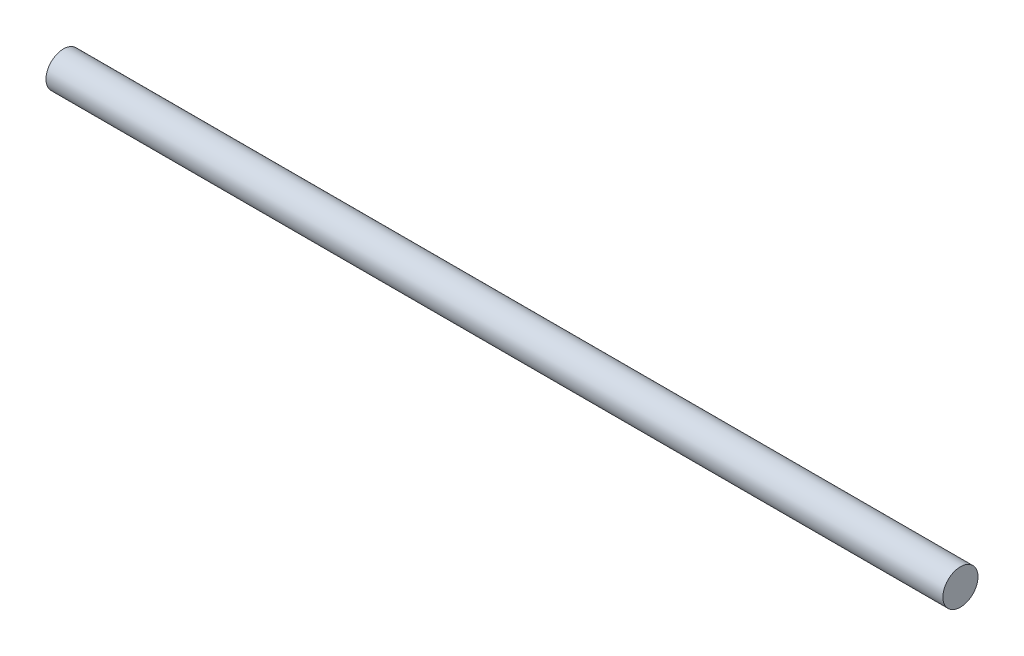
ISO-10303-21;
HEADER;
FILE_DESCRIPTION(('STEP AP214'),'2;1');
FILE_NAME('part.step','',(''),(''),'','','');
FILE_SCHEMA(('AUTOMOTIVE_DESIGN { 1 0 10303 214 1 1 1 1 }'));
ENDSEC;
DATA;
#1=APPLICATION_CONTEXT('core data for automotive mechanical design processes');
#2=APPLICATION_PROTOCOL_DEFINITION('international standard','automotive_design',2000,#1);
#3=PRODUCT_CONTEXT('',#1,'mechanical');
#4=PRODUCT('Part','Part','',(#3));
#5=PRODUCT_RELATED_PRODUCT_CATEGORY('part','',(#4));
#6=PRODUCT_DEFINITION_FORMATION('','',#4);
#7=PRODUCT_DEFINITION_CONTEXT('part definition',#1,'design');
#8=PRODUCT_DEFINITION('design','',#6,#7);
#9=PRODUCT_DEFINITION_SHAPE('','',#8);
#10=(LENGTH_UNIT() NAMED_UNIT(*) SI_UNIT(.MILLI.,.METRE.));
#11=(NAMED_UNIT(*) PLANE_ANGLE_UNIT() SI_UNIT($,.RADIAN.));
#12=(NAMED_UNIT(*) SI_UNIT($,.STERADIAN.) SOLID_ANGLE_UNIT());
#13=UNCERTAINTY_MEASURE_WITH_UNIT(LENGTH_MEASURE(1.E-05),#10,'distance_accuracy_value','');
#14=(GEOMETRIC_REPRESENTATION_CONTEXT(3) GLOBAL_UNCERTAINTY_ASSIGNED_CONTEXT((#13)) GLOBAL_UNIT_ASSIGNED_CONTEXT((#10,
#11,#12)) REPRESENTATION_CONTEXT('',''));
#15=CARTESIAN_POINT('',(0.,0.,0.));
#16=DIRECTION('',(0.,0.,1.));
#17=DIRECTION('',(1.,0.,0.));
#18=AXIS2_PLACEMENT_3D('',#15,#16,#17);
#19=CARTESIAN_POINT('',(230.,0.,0.));
#20=DIRECTION('',(-1.,0.,0.));
#21=DIRECTION('',(0.,0.,1.));
#22=AXIS2_PLACEMENT_3D('',#19,#20,#21);
#23=CYLINDRICAL_SURFACE('',#22,9.);
#24=CARTESIAN_POINT('',(230.,0.,0.));
#25=DIRECTION('',(1.,0.,0.));
#26=DIRECTION('',(0.,0.,-1.));
#27=AXIS2_PLACEMENT_3D('',#24,#25,#26);
#28=CIRCLE('',#27,9.);
#29=CARTESIAN_POINT('',(230.,0.,-9.));
#30=VERTEX_POINT('',#29);
#31=EDGE_CURVE('E10',#30,#30,#28,.T.);
#32=ORIENTED_EDGE('',*,*,#31,.F.);
#33=EDGE_LOOP('',(#32));
#34=FACE_BOUND('',#33,.T.);
#35=CARTESIAN_POINT('',(-230.,0.,0.));
#36=DIRECTION('',(1.,0.,0.));
#37=DIRECTION('',(0.,0.,-1.));
#38=AXIS2_PLACEMENT_3D('',#35,#36,#37);
#39=CIRCLE('',#38,9.);
#40=CARTESIAN_POINT('',(-230.,0.,-9.));
#41=VERTEX_POINT('',#40);
#42=EDGE_CURVE('E34',#41,#41,#39,.T.);
#43=ORIENTED_EDGE('',*,*,#42,.T.);
#44=EDGE_LOOP('',(#43));
#45=FACE_BOUND('',#44,.T.);
#46=ADVANCED_FACE('F31',(#34,#45),#23,.T.);
#47=CARTESIAN_POINT('',(230.,0.,0.));
#48=DIRECTION('',(1.,0.,0.));
#49=DIRECTION('',(0.,0.,-1.));
#50=AXIS2_PLACEMENT_3D('',#47,#48,#49);
#51=PLANE('',#50);
#52=ORIENTED_EDGE('',*,*,#31,.T.);
#53=EDGE_LOOP('',(#52));
#54=FACE_BOUND('',#53,.T.);
#55=ADVANCED_FACE('F46',(#54),#51,.T.);
#56=CARTESIAN_POINT('',(-230.,0.,0.));
#57=DIRECTION('',(1.,0.,0.));
#58=DIRECTION('',(0.,0.,-1.));
#59=AXIS2_PLACEMENT_3D('',#56,#57,#58);
#60=PLANE('',#59);
#61=ORIENTED_EDGE('',*,*,#42,.F.);
#62=EDGE_LOOP('',(#61));
#63=FACE_BOUND('',#62,.T.);
#64=ADVANCED_FACE('F44',(#63),#60,.F.);
#65=CLOSED_SHELL('',(#46,#55,#64));
#66=MANIFOLD_SOLID_BREP('B2',#65);
#67=ADVANCED_BREP_SHAPE_REPRESENTATION('',(#18,#66),#14);
#68=SHAPE_DEFINITION_REPRESENTATION(#9,#67);
ENDSEC;
END-ISO-10303-21;
